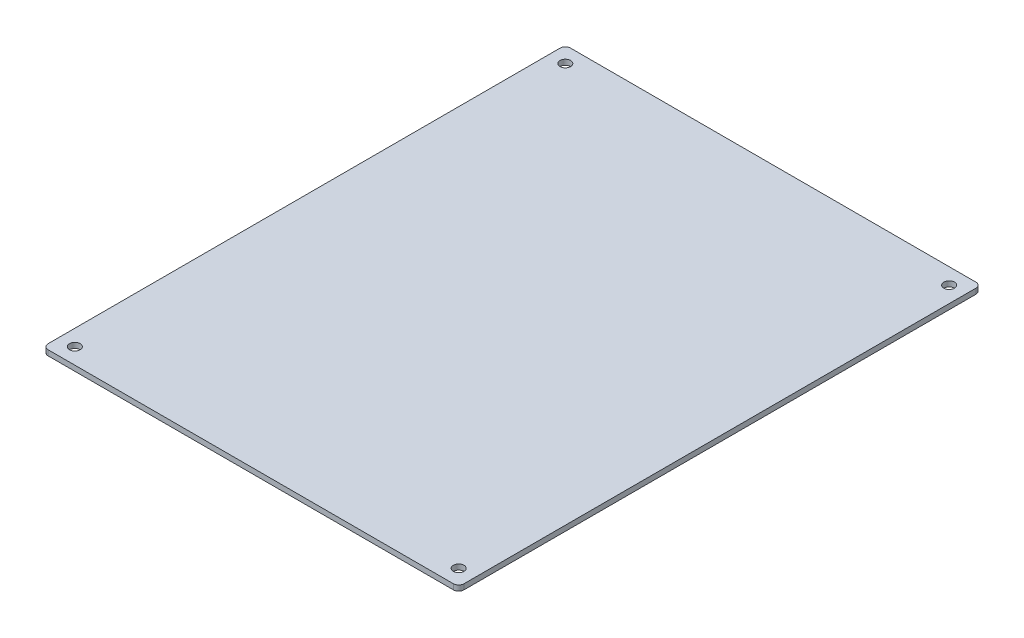
ISO-10303-21;
HEADER;
FILE_DESCRIPTION(('STEP AP214'),'2;1');
FILE_NAME('part.step','',(''),(''),'','','');
FILE_SCHEMA(('AUTOMOTIVE_DESIGN { 1 0 10303 214 1 1 1 1 }'));
ENDSEC;
DATA;
#1=APPLICATION_CONTEXT('core data for automotive mechanical design processes');
#2=APPLICATION_PROTOCOL_DEFINITION('international standard','automotive_design',2000,#1);
#3=PRODUCT_CONTEXT('',#1,'mechanical');
#4=PRODUCT('Part','Part','',(#3));
#5=PRODUCT_RELATED_PRODUCT_CATEGORY('part','',(#4));
#6=PRODUCT_DEFINITION_FORMATION('','',#4);
#7=PRODUCT_DEFINITION_CONTEXT('part definition',#1,'design');
#8=PRODUCT_DEFINITION('design','',#6,#7);
#9=PRODUCT_DEFINITION_SHAPE('','',#8);
#10=(LENGTH_UNIT() NAMED_UNIT(*) SI_UNIT(.MILLI.,.METRE.));
#11=(NAMED_UNIT(*) PLANE_ANGLE_UNIT() SI_UNIT($,.RADIAN.));
#12=(NAMED_UNIT(*) SI_UNIT($,.STERADIAN.) SOLID_ANGLE_UNIT());
#13=UNCERTAINTY_MEASURE_WITH_UNIT(LENGTH_MEASURE(1.E-05),#10,'distance_accuracy_value','');
#14=(GEOMETRIC_REPRESENTATION_CONTEXT(3) GLOBAL_UNCERTAINTY_ASSIGNED_CONTEXT((#13)) GLOBAL_UNIT_ASSIGNED_CONTEXT((#10,
#11,#12)) REPRESENTATION_CONTEXT('',''));
#15=CARTESIAN_POINT('',(0.,0.,0.));
#16=DIRECTION('',(0.,0.,1.));
#17=DIRECTION('',(1.,0.,0.));
#18=AXIS2_PLACEMENT_3D('',#15,#16,#17);
#19=CARTESIAN_POINT('',(0.,1.5875,0.));
#20=DIRECTION('',(0.,-1.,0.));
#21=DIRECTION('',(0.,0.,-1.));
#22=AXIS2_PLACEMENT_3D('',#19,#20,#21);
#23=PLANE('',#22);
#24=DIRECTION('',(0.,0.,1.));
#25=VECTOR('',#24,1.);
#26=CARTESIAN_POINT('',(0.,1.5875,0.));
#27=LINE('',#26,#25);
#28=CARTESIAN_POINT('',(0.,1.5875,-153.9875));
#29=VERTEX_POINT('',#28);
#30=CARTESIAN_POINT('',(0.,1.5875,-1.5875));
#31=VERTEX_POINT('',#30);
#32=EDGE_CURVE('E141',#29,#31,#27,.T.);
#33=ORIENTED_EDGE('',*,*,#32,.T.);
#34=CARTESIAN_POINT('',(1.5875,1.5875,-1.5875));
#35=DIRECTION('',(0.,-1.,0.));
#36=DIRECTION('',(0.,0.,-1.));
#37=AXIS2_PLACEMENT_3D('',#34,#35,#36);
#38=CIRCLE('',#37,1.5875);
#39=CARTESIAN_POINT('',(1.5875,1.5875,0.));
#40=VERTEX_POINT('',#39);
#41=EDGE_CURVE('E158',#31,#40,#38,.F.);
#42=ORIENTED_EDGE('',*,*,#41,.T.);
#43=DIRECTION('',(1.,0.,0.));
#44=VECTOR('',#43,1.);
#45=CARTESIAN_POINT('',(0.,1.5875,0.));
#46=LINE('',#45,#44);
#47=CARTESIAN_POINT('',(122.2375,1.5875,0.));
#48=VERTEX_POINT('',#47);
#49=EDGE_CURVE('E121',#40,#48,#46,.T.);
#50=ORIENTED_EDGE('',*,*,#49,.T.);
#51=CARTESIAN_POINT('',(122.2375,1.5875,-1.5875));
#52=DIRECTION('',(0.,-1.,0.));
#53=DIRECTION('',(0.,0.,-1.));
#54=AXIS2_PLACEMENT_3D('',#51,#52,#53);
#55=CIRCLE('',#54,1.5875);
#56=CARTESIAN_POINT('',(123.825,1.5875,-1.5875));
#57=VERTEX_POINT('',#56);
#58=EDGE_CURVE('E156',#48,#57,#55,.F.);
#59=ORIENTED_EDGE('',*,*,#58,.T.);
#60=DIRECTION('',(0.,0.,-1.));
#61=VECTOR('',#60,1.);
#62=CARTESIAN_POINT('',(123.825,1.5875,0.));
#63=LINE('',#62,#61);
#64=CARTESIAN_POINT('',(123.825,1.5875,-153.9875));
#65=VERTEX_POINT('',#64);
#66=EDGE_CURVE('E166',#57,#65,#63,.T.);
#67=ORIENTED_EDGE('',*,*,#66,.T.);
#68=CARTESIAN_POINT('',(122.2375,1.5875,-153.9875));
#69=DIRECTION('',(0.,-1.,0.));
#70=DIRECTION('',(0.,0.,-1.));
#71=AXIS2_PLACEMENT_3D('',#68,#69,#70);
#72=CIRCLE('',#71,1.5875);
#73=CARTESIAN_POINT('',(122.2375,1.5875,-155.575));
#74=VERTEX_POINT('',#73);
#75=EDGE_CURVE('E58',#65,#74,#72,.F.);
#76=ORIENTED_EDGE('',*,*,#75,.T.);
#77=DIRECTION('',(-1.,0.,0.));
#78=VECTOR('',#77,1.);
#79=CARTESIAN_POINT('',(0.,1.5875,-155.575));
#80=LINE('',#79,#78);
#81=CARTESIAN_POINT('',(1.5875,1.5875,-155.575));
#82=VERTEX_POINT('',#81);
#83=EDGE_CURVE('E145',#74,#82,#80,.T.);
#84=ORIENTED_EDGE('',*,*,#83,.T.);
#85=CARTESIAN_POINT('',(1.5875,1.5875,-153.9875));
#86=DIRECTION('',(0.,-1.,0.));
#87=DIRECTION('',(0.,0.,-1.));
#88=AXIS2_PLACEMENT_3D('',#85,#86,#87);
#89=CIRCLE('',#88,1.5875);
#90=EDGE_CURVE('E153',#82,#29,#89,.F.);
#91=ORIENTED_EDGE('',*,*,#90,.T.);
#92=EDGE_LOOP('',(#33,#42,#50,#59,#67,#76,#84,#91));
#93=FACE_BOUND('',#92,.T.);
#94=CARTESIAN_POINT('',(4.7625,1.5875,-150.8125));
#95=DIRECTION('',(0.,1.,0.));
#96=DIRECTION('',(0.,0.,1.));
#97=AXIS2_PLACEMENT_3D('',#94,#95,#96);
#98=CIRCLE('',#97,1.5875);
#99=CARTESIAN_POINT('',(4.7625,1.5875,-149.225));
#100=VERTEX_POINT('',#99);
#101=EDGE_CURVE('E137',#100,#100,#98,.T.);
#102=ORIENTED_EDGE('',*,*,#101,.F.);
#103=EDGE_LOOP('',(#102));
#104=FACE_BOUND('',#103,.T.);
#105=CARTESIAN_POINT('',(119.0625,1.5875,-150.8125));
#106=DIRECTION('',(0.,1.,0.));
#107=DIRECTION('',(0.,0.,1.));
#108=AXIS2_PLACEMENT_3D('',#105,#106,#107);
#109=CIRCLE('',#108,1.58749999999999);
#110=CARTESIAN_POINT('',(119.0625,1.5875,-149.225));
#111=VERTEX_POINT('',#110);
#112=EDGE_CURVE('E189',#111,#111,#109,.T.);
#113=ORIENTED_EDGE('',*,*,#112,.F.);
#114=EDGE_LOOP('',(#113));
#115=FACE_BOUND('',#114,.T.);
#116=CARTESIAN_POINT('',(119.0625,1.5875,-4.7625));
#117=DIRECTION('',(0.,1.,0.));
#118=DIRECTION('',(0.,0.,1.));
#119=AXIS2_PLACEMENT_3D('',#116,#117,#118);
#120=CIRCLE('',#119,1.5875);
#121=CARTESIAN_POINT('',(119.0625,1.5875,-3.175));
#122=VERTEX_POINT('',#121);
#123=EDGE_CURVE('E194',#122,#122,#120,.T.);
#124=ORIENTED_EDGE('',*,*,#123,.F.);
#125=EDGE_LOOP('',(#124));
#126=FACE_BOUND('',#125,.T.);
#127=CARTESIAN_POINT('',(4.7625,1.5875,-4.7625));
#128=DIRECTION('',(0.,1.,0.));
#129=DIRECTION('',(0.,0.,1.));
#130=AXIS2_PLACEMENT_3D('',#127,#128,#129);
#131=CIRCLE('',#130,1.5875);
#132=CARTESIAN_POINT('',(4.7625,1.5875,-3.175));
#133=VERTEX_POINT('',#132);
#134=EDGE_CURVE('E196',#133,#133,#131,.T.);
#135=ORIENTED_EDGE('',*,*,#134,.F.);
#136=EDGE_LOOP('',(#135));
#137=FACE_BOUND('',#136,.T.);
#138=ADVANCED_FACE('F39',(#93,#104,#115,#126,#137),#23,.F.);
#139=CARTESIAN_POINT('',(0.,0.,0.));
#140=DIRECTION('',(0.,-1.,0.));
#141=DIRECTION('',(0.,0.,-1.));
#142=AXIS2_PLACEMENT_3D('',#139,#140,#141);
#143=PLANE('',#142);
#144=CARTESIAN_POINT('',(119.0625,0.,-4.7625));
#145=DIRECTION('',(0.,1.,0.));
#146=DIRECTION('',(0.,0.,1.));
#147=AXIS2_PLACEMENT_3D('',#144,#145,#146);
#148=CIRCLE('',#147,1.5875);
#149=CARTESIAN_POINT('',(119.0625,0.,-3.175));
#150=VERTEX_POINT('',#149);
#151=EDGE_CURVE('E191',#150,#150,#148,.T.);
#152=ORIENTED_EDGE('',*,*,#151,.T.);
#153=EDGE_LOOP('',(#152));
#154=FACE_BOUND('',#153,.T.);
#155=CARTESIAN_POINT('',(4.7625,0.,-150.8125));
#156=DIRECTION('',(0.,1.,0.));
#157=DIRECTION('',(0.,0.,1.));
#158=AXIS2_PLACEMENT_3D('',#155,#156,#157);
#159=CIRCLE('',#158,1.5875);
#160=CARTESIAN_POINT('',(4.7625,0.,-149.225));
#161=VERTEX_POINT('',#160);
#162=EDGE_CURVE('E181',#161,#161,#159,.T.);
#163=ORIENTED_EDGE('',*,*,#162,.T.);
#164=EDGE_LOOP('',(#163));
#165=FACE_BOUND('',#164,.T.);
#166=DIRECTION('',(1.,0.,0.));
#167=VECTOR('',#166,1.);
#168=CARTESIAN_POINT('',(0.,0.,0.));
#169=LINE('',#168,#167);
#170=CARTESIAN_POINT('',(1.5875,0.,0.));
#171=VERTEX_POINT('',#170);
#172=CARTESIAN_POINT('',(122.2375,0.,0.));
#173=VERTEX_POINT('',#172);
#174=EDGE_CURVE('E124',#171,#173,#169,.T.);
#175=ORIENTED_EDGE('',*,*,#174,.F.);
#176=CARTESIAN_POINT('',(1.5875,0.,-1.5875));
#177=DIRECTION('',(0.,-1.,0.));
#178=DIRECTION('',(0.,0.,-1.));
#179=AXIS2_PLACEMENT_3D('',#176,#177,#178);
#180=CIRCLE('',#179,1.5875);
#181=CARTESIAN_POINT('',(0.,0.,-1.5875));
#182=VERTEX_POINT('',#181);
#183=EDGE_CURVE('E104',#171,#182,#180,.T.);
#184=ORIENTED_EDGE('',*,*,#183,.T.);
#185=DIRECTION('',(0.,0.,1.));
#186=VECTOR('',#185,1.);
#187=CARTESIAN_POINT('',(0.,0.,0.));
#188=LINE('',#187,#186);
#189=CARTESIAN_POINT('',(0.,0.,-153.9875));
#190=VERTEX_POINT('',#189);
#191=EDGE_CURVE('E135',#190,#182,#188,.T.);
#192=ORIENTED_EDGE('',*,*,#191,.F.);
#193=CARTESIAN_POINT('',(1.5875,0.,-153.9875));
#194=DIRECTION('',(0.,-1.,0.));
#195=DIRECTION('',(0.,0.,-1.));
#196=AXIS2_PLACEMENT_3D('',#193,#194,#195);
#197=CIRCLE('',#196,1.5875);
#198=CARTESIAN_POINT('',(1.5875,0.,-155.575));
#199=VERTEX_POINT('',#198);
#200=EDGE_CURVE('E127',#190,#199,#197,.T.);
#201=ORIENTED_EDGE('',*,*,#200,.T.);
#202=DIRECTION('',(-1.,0.,0.));
#203=VECTOR('',#202,1.);
#204=CARTESIAN_POINT('',(0.,0.,-155.575));
#205=LINE('',#204,#203);
#206=CARTESIAN_POINT('',(122.2375,0.,-155.575));
#207=VERTEX_POINT('',#206);
#208=EDGE_CURVE('E138',#207,#199,#205,.T.);
#209=ORIENTED_EDGE('',*,*,#208,.F.);
#210=CARTESIAN_POINT('',(122.2375,0.,-153.9875));
#211=DIRECTION('',(0.,-1.,0.));
#212=DIRECTION('',(0.,0.,-1.));
#213=AXIS2_PLACEMENT_3D('',#210,#211,#212);
#214=CIRCLE('',#213,1.5875);
#215=CARTESIAN_POINT('',(123.825,0.,-153.9875));
#216=VERTEX_POINT('',#215);
#217=EDGE_CURVE('E150',#207,#216,#214,.T.);
#218=ORIENTED_EDGE('',*,*,#217,.T.);
#219=DIRECTION('',(0.,0.,-1.));
#220=VECTOR('',#219,1.);
#221=CARTESIAN_POINT('',(123.825,0.,0.));
#222=LINE('',#221,#220);
#223=CARTESIAN_POINT('',(123.825,0.,-1.5875));
#224=VERTEX_POINT('',#223);
#225=EDGE_CURVE('E131',#224,#216,#222,.T.);
#226=ORIENTED_EDGE('',*,*,#225,.F.);
#227=CARTESIAN_POINT('',(122.2375,0.,-1.5875));
#228=DIRECTION('',(0.,-1.,0.));
#229=DIRECTION('',(0.,0.,-1.));
#230=AXIS2_PLACEMENT_3D('',#227,#228,#229);
#231=CIRCLE('',#230,1.5875);
#232=EDGE_CURVE('E119',#224,#173,#231,.T.);
#233=ORIENTED_EDGE('',*,*,#232,.T.);
#234=EDGE_LOOP('',(#175,#184,#192,#201,#209,#218,#226,#233));
#235=FACE_BOUND('',#234,.T.);
#236=CARTESIAN_POINT('',(119.0625,0.,-150.8125));
#237=DIRECTION('',(0.,1.,0.));
#238=DIRECTION('',(0.,0.,1.));
#239=AXIS2_PLACEMENT_3D('',#236,#237,#238);
#240=CIRCLE('',#239,1.58749999999999);
#241=CARTESIAN_POINT('',(119.0625,0.,-149.225));
#242=VERTEX_POINT('',#241);
#243=EDGE_CURVE('E188',#242,#242,#240,.T.);
#244=ORIENTED_EDGE('',*,*,#243,.T.);
#245=EDGE_LOOP('',(#244));
#246=FACE_BOUND('',#245,.T.);
#247=CARTESIAN_POINT('',(4.7625,0.,-4.7625));
#248=DIRECTION('',(0.,1.,0.));
#249=DIRECTION('',(0.,0.,1.));
#250=AXIS2_PLACEMENT_3D('',#247,#248,#249);
#251=CIRCLE('',#250,1.5875);
#252=CARTESIAN_POINT('',(4.7625,0.,-3.175));
#253=VERTEX_POINT('',#252);
#254=EDGE_CURVE('E203',#253,#253,#251,.T.);
#255=ORIENTED_EDGE('',*,*,#254,.T.);
#256=EDGE_LOOP('',(#255));
#257=FACE_BOUND('',#256,.T.);
#258=ADVANCED_FACE('F129',(#154,#165,#235,#246,#257),#143,.T.);
#259=CARTESIAN_POINT('',(0.,1.5875,0.));
#260=DIRECTION('',(1.,0.,0.));
#261=DIRECTION('',(0.,0.,-1.));
#262=AXIS2_PLACEMENT_3D('',#259,#260,#261);
#263=PLANE('',#262);
#264=ORIENTED_EDGE('',*,*,#191,.T.);
#265=DIRECTION('',(0.,-1.,0.));
#266=VECTOR('',#265,1.);
#267=CARTESIAN_POINT('',(0.,1.5875,-1.5875));
#268=LINE('',#267,#266);
#269=EDGE_CURVE('E109',#182,#31,#268,.F.);
#270=ORIENTED_EDGE('',*,*,#269,.T.);
#271=ORIENTED_EDGE('',*,*,#32,.F.);
#272=DIRECTION('',(0.,-1.,0.));
#273=VECTOR('',#272,1.);
#274=CARTESIAN_POINT('',(0.,1.5875,-153.9875));
#275=LINE('',#274,#273);
#276=EDGE_CURVE('E113',#29,#190,#275,.T.);
#277=ORIENTED_EDGE('',*,*,#276,.T.);
#278=EDGE_LOOP('',(#264,#270,#271,#277));
#279=FACE_BOUND('',#278,.T.);
#280=ADVANCED_FACE('F216',(#279),#263,.F.);
#281=CARTESIAN_POINT('',(0.,1.5875,0.));
#282=DIRECTION('',(0.,0.,-1.));
#283=DIRECTION('',(-1.,0.,0.));
#284=AXIS2_PLACEMENT_3D('',#281,#282,#283);
#285=PLANE('',#284);
#286=ORIENTED_EDGE('',*,*,#49,.F.);
#287=DIRECTION('',(0.,-1.,0.));
#288=VECTOR('',#287,1.);
#289=CARTESIAN_POINT('',(1.5875,1.5875,0.));
#290=LINE('',#289,#288);
#291=EDGE_CURVE('E108',#40,#171,#290,.T.);
#292=ORIENTED_EDGE('',*,*,#291,.T.);
#293=ORIENTED_EDGE('',*,*,#174,.T.);
#294=DIRECTION('',(0.,-1.,0.));
#295=VECTOR('',#294,1.);
#296=CARTESIAN_POINT('',(122.2375,1.5875,0.));
#297=LINE('',#296,#295);
#298=EDGE_CURVE('E130',#173,#48,#297,.F.);
#299=ORIENTED_EDGE('',*,*,#298,.T.);
#300=EDGE_LOOP('',(#286,#292,#293,#299));
#301=FACE_BOUND('',#300,.T.);
#302=ADVANCED_FACE('F123',(#301),#285,.F.);
#303=CARTESIAN_POINT('',(123.825,1.5875,0.));
#304=DIRECTION('',(-1.,0.,0.));
#305=DIRECTION('',(0.,0.,1.));
#306=AXIS2_PLACEMENT_3D('',#303,#304,#305);
#307=PLANE('',#306);
#308=ORIENTED_EDGE('',*,*,#66,.F.);
#309=DIRECTION('',(0.,-1.,0.));
#310=VECTOR('',#309,1.);
#311=CARTESIAN_POINT('',(123.825,1.5875,-1.5875));
#312=LINE('',#311,#310);
#313=EDGE_CURVE('E165',#57,#224,#312,.T.);
#314=ORIENTED_EDGE('',*,*,#313,.T.);
#315=ORIENTED_EDGE('',*,*,#225,.T.);
#316=DIRECTION('',(0.,-1.,0.));
#317=VECTOR('',#316,1.);
#318=CARTESIAN_POINT('',(123.825,1.5875,-153.9875));
#319=LINE('',#318,#317);
#320=EDGE_CURVE('E159',#216,#65,#319,.F.);
#321=ORIENTED_EDGE('',*,*,#320,.T.);
#322=EDGE_LOOP('',(#308,#314,#315,#321));
#323=FACE_BOUND('',#322,.T.);
#324=ADVANCED_FACE('F170',(#323),#307,.F.);
#325=CARTESIAN_POINT('',(0.,1.5875,-155.575));
#326=DIRECTION('',(0.,0.,1.));
#327=DIRECTION('',(1.,0.,0.));
#328=AXIS2_PLACEMENT_3D('',#325,#326,#327);
#329=PLANE('',#328);
#330=ORIENTED_EDGE('',*,*,#83,.F.);
#331=DIRECTION('',(0.,-1.,0.));
#332=VECTOR('',#331,1.);
#333=CARTESIAN_POINT('',(122.2375,1.5875,-155.575));
#334=LINE('',#333,#332);
#335=EDGE_CURVE('E11',#74,#207,#334,.T.);
#336=ORIENTED_EDGE('',*,*,#335,.T.);
#337=ORIENTED_EDGE('',*,*,#208,.T.);
#338=DIRECTION('',(0.,-1.,0.));
#339=VECTOR('',#338,1.);
#340=CARTESIAN_POINT('',(1.5875,1.5875,-155.575));
#341=LINE('',#340,#339);
#342=EDGE_CURVE('E50',#199,#82,#341,.F.);
#343=ORIENTED_EDGE('',*,*,#342,.T.);
#344=EDGE_LOOP('',(#330,#336,#337,#343));
#345=FACE_BOUND('',#344,.T.);
#346=ADVANCED_FACE('F178',(#345),#329,.F.);
#347=CARTESIAN_POINT('',(4.7625,1.5875,-150.8125));
#348=DIRECTION('',(0.,-1.,0.));
#349=DIRECTION('',(0.,0.,-1.));
#350=AXIS2_PLACEMENT_3D('',#347,#348,#349);
#351=CYLINDRICAL_SURFACE('',#350,1.5875);
#352=ORIENTED_EDGE('',*,*,#101,.T.);
#353=EDGE_LOOP('',(#352));
#354=FACE_BOUND('',#353,.T.);
#355=ORIENTED_EDGE('',*,*,#162,.F.);
#356=EDGE_LOOP('',(#355));
#357=FACE_BOUND('',#356,.T.);
#358=ADVANCED_FACE('F222',(#354,#357),#351,.F.);
#359=CARTESIAN_POINT('',(119.0625,1.5875,-150.8125));
#360=DIRECTION('',(0.,-1.,0.));
#361=DIRECTION('',(0.,0.,-1.));
#362=AXIS2_PLACEMENT_3D('',#359,#360,#361);
#363=CYLINDRICAL_SURFACE('',#362,1.58749999999999);
#364=ORIENTED_EDGE('',*,*,#112,.T.);
#365=EDGE_LOOP('',(#364));
#366=FACE_BOUND('',#365,.T.);
#367=ORIENTED_EDGE('',*,*,#243,.F.);
#368=EDGE_LOOP('',(#367));
#369=FACE_BOUND('',#368,.T.);
#370=ADVANCED_FACE('F278',(#366,#369),#363,.F.);
#371=CARTESIAN_POINT('',(119.0625,1.5875,-4.7625));
#372=DIRECTION('',(0.,-1.,0.));
#373=DIRECTION('',(0.,0.,-1.));
#374=AXIS2_PLACEMENT_3D('',#371,#372,#373);
#375=CYLINDRICAL_SURFACE('',#374,1.5875);
#376=ORIENTED_EDGE('',*,*,#123,.T.);
#377=EDGE_LOOP('',(#376));
#378=FACE_BOUND('',#377,.T.);
#379=ORIENTED_EDGE('',*,*,#151,.F.);
#380=EDGE_LOOP('',(#379));
#381=FACE_BOUND('',#380,.T.);
#382=ADVANCED_FACE('F271',(#378,#381),#375,.F.);
#383=CARTESIAN_POINT('',(4.7625,1.5875,-4.7625));
#384=DIRECTION('',(0.,-1.,0.));
#385=DIRECTION('',(0.,0.,-1.));
#386=AXIS2_PLACEMENT_3D('',#383,#384,#385);
#387=CYLINDRICAL_SURFACE('',#386,1.5875);
#388=ORIENTED_EDGE('',*,*,#134,.T.);
#389=EDGE_LOOP('',(#388));
#390=FACE_BOUND('',#389,.T.);
#391=ORIENTED_EDGE('',*,*,#254,.F.);
#392=EDGE_LOOP('',(#391));
#393=FACE_BOUND('',#392,.T.);
#394=ADVANCED_FACE('F210',(#390,#393),#387,.F.);
#395=CARTESIAN_POINT('',(1.5875,1.5875,-1.5875));
#396=DIRECTION('',(0.,-1.,0.));
#397=DIRECTION('',(0.,0.,-1.));
#398=AXIS2_PLACEMENT_3D('',#395,#396,#397);
#399=CYLINDRICAL_SURFACE('',#398,1.5875);
#400=ORIENTED_EDGE('',*,*,#41,.F.);
#401=ORIENTED_EDGE('',*,*,#269,.F.);
#402=ORIENTED_EDGE('',*,*,#183,.F.);
#403=ORIENTED_EDGE('',*,*,#291,.F.);
#404=EDGE_LOOP('',(#400,#401,#402,#403));
#405=FACE_BOUND('',#404,.T.);
#406=ADVANCED_FACE('F107',(#405),#399,.T.);
#407=CARTESIAN_POINT('',(122.2375,1.5875,-1.5875));
#408=DIRECTION('',(0.,-1.,0.));
#409=DIRECTION('',(0.,0.,-1.));
#410=AXIS2_PLACEMENT_3D('',#407,#408,#409);
#411=CYLINDRICAL_SURFACE('',#410,1.5875);
#412=ORIENTED_EDGE('',*,*,#58,.F.);
#413=ORIENTED_EDGE('',*,*,#298,.F.);
#414=ORIENTED_EDGE('',*,*,#232,.F.);
#415=ORIENTED_EDGE('',*,*,#313,.F.);
#416=EDGE_LOOP('',(#412,#413,#414,#415));
#417=FACE_BOUND('',#416,.T.);
#418=ADVANCED_FACE('F231',(#417),#411,.T.);
#419=CARTESIAN_POINT('',(122.2375,1.5875,-153.9875));
#420=DIRECTION('',(0.,-1.,0.));
#421=DIRECTION('',(0.,0.,-1.));
#422=AXIS2_PLACEMENT_3D('',#419,#420,#421);
#423=CYLINDRICAL_SURFACE('',#422,1.5875);
#424=ORIENTED_EDGE('',*,*,#75,.F.);
#425=ORIENTED_EDGE('',*,*,#320,.F.);
#426=ORIENTED_EDGE('',*,*,#217,.F.);
#427=ORIENTED_EDGE('',*,*,#335,.F.);
#428=EDGE_LOOP('',(#424,#425,#426,#427));
#429=FACE_BOUND('',#428,.T.);
#430=ADVANCED_FACE('F172',(#429),#423,.T.);
#431=CARTESIAN_POINT('',(1.5875,1.5875,-153.9875));
#432=DIRECTION('',(0.,-1.,0.));
#433=DIRECTION('',(0.,0.,-1.));
#434=AXIS2_PLACEMENT_3D('',#431,#432,#433);
#435=CYLINDRICAL_SURFACE('',#434,1.5875);
#436=ORIENTED_EDGE('',*,*,#90,.F.);
#437=ORIENTED_EDGE('',*,*,#342,.F.);
#438=ORIENTED_EDGE('',*,*,#200,.F.);
#439=ORIENTED_EDGE('',*,*,#276,.F.);
#440=EDGE_LOOP('',(#436,#437,#438,#439));
#441=FACE_BOUND('',#440,.T.);
#442=ADVANCED_FACE('F41',(#441),#435,.T.);
#443=CLOSED_SHELL('',(#138,#258,#280,#302,#324,#346,#358,#370,#382,#394,#406,#418,#430,#442));
#444=MANIFOLD_SOLID_BREP('B2',#443);
#445=ADVANCED_BREP_SHAPE_REPRESENTATION('',(#18,#444),#14);
#446=SHAPE_DEFINITION_REPRESENTATION(#9,#445);
ENDSEC;
END-ISO-10303-21;
